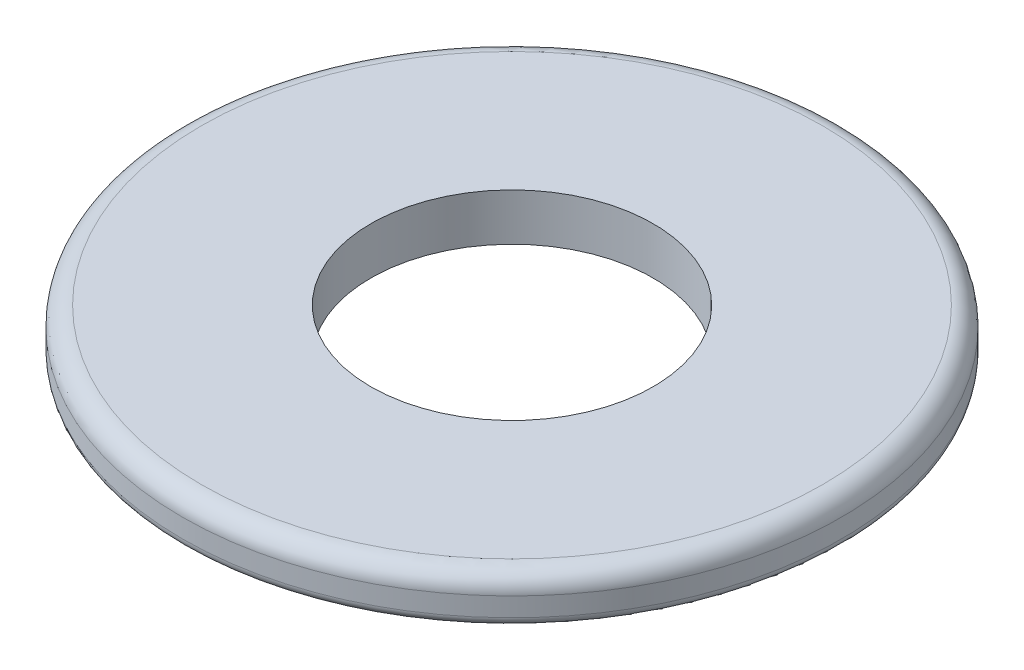
ISO-10303-21;
HEADER;
FILE_DESCRIPTION(('STEP AP214'),'2;1');
FILE_NAME('part.step','',(''),(''),'','','');
FILE_SCHEMA(('AUTOMOTIVE_DESIGN { 1 0 10303 214 1 1 1 1 }'));
ENDSEC;
DATA;
#1=APPLICATION_CONTEXT('core data for automotive mechanical design processes');
#2=APPLICATION_PROTOCOL_DEFINITION('international standard','automotive_design',2000,#1);
#3=PRODUCT_CONTEXT('',#1,'mechanical');
#4=PRODUCT('Part','Part','',(#3));
#5=PRODUCT_RELATED_PRODUCT_CATEGORY('part','',(#4));
#6=PRODUCT_DEFINITION_FORMATION('','',#4);
#7=PRODUCT_DEFINITION_CONTEXT('part definition',#1,'design');
#8=PRODUCT_DEFINITION('design','',#6,#7);
#9=PRODUCT_DEFINITION_SHAPE('','',#8);
#10=(LENGTH_UNIT() NAMED_UNIT(*) SI_UNIT(.MILLI.,.METRE.));
#11=(NAMED_UNIT(*) PLANE_ANGLE_UNIT() SI_UNIT($,.RADIAN.));
#12=(NAMED_UNIT(*) SI_UNIT($,.STERADIAN.) SOLID_ANGLE_UNIT());
#13=UNCERTAINTY_MEASURE_WITH_UNIT(LENGTH_MEASURE(1.E-05),#10,'distance_accuracy_value','');
#14=(GEOMETRIC_REPRESENTATION_CONTEXT(3) GLOBAL_UNCERTAINTY_ASSIGNED_CONTEXT((#13)) GLOBAL_UNIT_ASSIGNED_CONTEXT((#10,
#11,#12)) REPRESENTATION_CONTEXT('',''));
#15=CARTESIAN_POINT('',(0.,0.,0.));
#16=DIRECTION('',(0.,0.,1.));
#17=DIRECTION('',(1.,0.,0.));
#18=AXIS2_PLACEMENT_3D('',#15,#16,#17);
#19=CARTESIAN_POINT('',(0.,0.5,0.));
#20=DIRECTION('',(0.,1.,0.));
#21=DIRECTION('',(0.,0.,1.));
#22=AXIS2_PLACEMENT_3D('',#19,#20,#21);
#23=PLANE('',#22);
#24=CARTESIAN_POINT('',(0.,0.5,0.));
#25=DIRECTION('',(0.,1.,0.));
#26=DIRECTION('',(0.,0.,1.));
#27=AXIS2_PLACEMENT_3D('',#24,#25,#26);
#28=CIRCLE('',#27,3.3);
#29=CARTESIAN_POINT('',(0.,0.5,3.3));
#30=VERTEX_POINT('',#29);
#31=EDGE_CURVE('E52',#30,#30,#28,.T.);
#32=ORIENTED_EDGE('',*,*,#31,.T.);
#33=EDGE_LOOP('',(#32));
#34=FACE_BOUND('',#33,.T.);
#35=CARTESIAN_POINT('',(0.,0.5,0.));
#36=DIRECTION('',(0.,1.,0.));
#37=DIRECTION('',(0.,0.,1.));
#38=AXIS2_PLACEMENT_3D('',#35,#36,#37);
#39=CIRCLE('',#38,1.5);
#40=CARTESIAN_POINT('',(0.,0.5,1.5));
#41=VERTEX_POINT('',#40);
#42=EDGE_CURVE('E57',#41,#41,#39,.T.);
#43=ORIENTED_EDGE('',*,*,#42,.F.);
#44=EDGE_LOOP('',(#43));
#45=FACE_BOUND('',#44,.T.);
#46=ADVANCED_FACE('F37',(#34,#45),#23,.T.);
#47=CARTESIAN_POINT('',(0.,0.,0.));
#48=DIRECTION('',(0.,1.,0.));
#49=DIRECTION('',(0.,0.,1.));
#50=AXIS2_PLACEMENT_3D('',#47,#48,#49);
#51=PLANE('',#50);
#52=CARTESIAN_POINT('',(0.,0.,0.));
#53=DIRECTION('',(0.,1.,0.));
#54=DIRECTION('',(0.,0.,1.));
#55=AXIS2_PLACEMENT_3D('',#52,#53,#54);
#56=CIRCLE('',#55,3.4);
#57=CARTESIAN_POINT('',(0.,0.,3.4));
#58=VERTEX_POINT('',#57);
#59=EDGE_CURVE('E10',#58,#58,#56,.F.);
#60=ORIENTED_EDGE('',*,*,#59,.T.);
#61=EDGE_LOOP('',(#60));
#62=FACE_BOUND('',#61,.T.);
#63=CARTESIAN_POINT('',(0.,0.,0.));
#64=DIRECTION('',(0.,1.,0.));
#65=DIRECTION('',(0.,0.,1.));
#66=AXIS2_PLACEMENT_3D('',#63,#64,#65);
#67=CIRCLE('',#66,1.5);
#68=CARTESIAN_POINT('',(0.,0.,1.5));
#69=VERTEX_POINT('',#68);
#70=EDGE_CURVE('E58',#69,#69,#67,.T.);
#71=ORIENTED_EDGE('',*,*,#70,.T.);
#72=EDGE_LOOP('',(#71));
#73=FACE_BOUND('',#72,.T.);
#74=ADVANCED_FACE('F68',(#62,#73),#51,.F.);
#75=CARTESIAN_POINT('',(0.,0.5,0.));
#76=DIRECTION('',(0.,-1.,0.));
#77=DIRECTION('',(0.,0.,-1.));
#78=AXIS2_PLACEMENT_3D('',#75,#76,#77);
#79=CYLINDRICAL_SURFACE('',#78,3.5);
#80=CARTESIAN_POINT('',(0.,0.1,0.));
#81=DIRECTION('',(0.,1.,0.));
#82=DIRECTION('',(0.,0.,1.));
#83=AXIS2_PLACEMENT_3D('',#80,#81,#82);
#84=CIRCLE('',#83,3.5);
#85=CARTESIAN_POINT('',(0.,0.1,3.5));
#86=VERTEX_POINT('',#85);
#87=EDGE_CURVE('E44',#86,#86,#84,.T.);
#88=ORIENTED_EDGE('',*,*,#87,.T.);
#89=EDGE_LOOP('',(#88));
#90=FACE_BOUND('',#89,.T.);
#91=CARTESIAN_POINT('',(0.,0.3,0.));
#92=DIRECTION('',(0.,1.,0.));
#93=DIRECTION('',(0.,0.,1.));
#94=AXIS2_PLACEMENT_3D('',#91,#92,#93);
#95=CIRCLE('',#94,3.5);
#96=CARTESIAN_POINT('',(0.,0.3,3.5));
#97=VERTEX_POINT('',#96);
#98=EDGE_CURVE('E48',#97,#97,#95,.F.);
#99=ORIENTED_EDGE('',*,*,#98,.T.);
#100=EDGE_LOOP('',(#99));
#101=FACE_BOUND('',#100,.T.);
#102=ADVANCED_FACE('F76',(#90,#101),#79,.T.);
#103=CARTESIAN_POINT('',(0.,0.5,0.));
#104=DIRECTION('',(0.,-1.,0.));
#105=DIRECTION('',(0.,0.,-1.));
#106=AXIS2_PLACEMENT_3D('',#103,#104,#105);
#107=CYLINDRICAL_SURFACE('',#106,1.5);
#108=ORIENTED_EDGE('',*,*,#42,.T.);
#109=EDGE_LOOP('',(#108));
#110=FACE_BOUND('',#109,.T.);
#111=ORIENTED_EDGE('',*,*,#70,.F.);
#112=EDGE_LOOP('',(#111));
#113=FACE_BOUND('',#112,.T.);
#114=ADVANCED_FACE('F64',(#110,#113),#107,.F.);
#115=CARTESIAN_POINT('',(0.,0.3,0.));
#116=DIRECTION('',(0.,1.,0.));
#117=DIRECTION('',(0.,0.,1.));
#118=AXIS2_PLACEMENT_3D('',#115,#116,#117);
#119=TOROIDAL_SURFACE('',#118,3.3,0.2);
#120=ORIENTED_EDGE('',*,*,#98,.F.);
#121=EDGE_LOOP('',(#120));
#122=FACE_BOUND('',#121,.T.);
#123=ORIENTED_EDGE('',*,*,#31,.F.);
#124=EDGE_LOOP('',(#123));
#125=FACE_BOUND('',#124,.T.);
#126=ADVANCED_FACE('F81',(#122,#125),#119,.T.);
#127=CARTESIAN_POINT('',(0.,0.1,0.));
#128=DIRECTION('',(0.,1.,0.));
#129=DIRECTION('',(0.,0.,1.));
#130=AXIS2_PLACEMENT_3D('',#127,#128,#129);
#131=TOROIDAL_SURFACE('',#130,3.4,0.1);
#132=ORIENTED_EDGE('',*,*,#59,.F.);
#133=EDGE_LOOP('',(#132));
#134=FACE_BOUND('',#133,.T.);
#135=ORIENTED_EDGE('',*,*,#87,.F.);
#136=EDGE_LOOP('',(#135));
#137=FACE_BOUND('',#136,.T.);
#138=ADVANCED_FACE('F39',(#134,#137),#131,.T.);
#139=CLOSED_SHELL('',(#46,#74,#102,#114,#126,#138));
#140=MANIFOLD_SOLID_BREP('B2',#139);
#141=ADVANCED_BREP_SHAPE_REPRESENTATION('',(#18,#140),#14);
#142=SHAPE_DEFINITION_REPRESENTATION(#9,#141);
ENDSEC;
END-ISO-10303-21;
